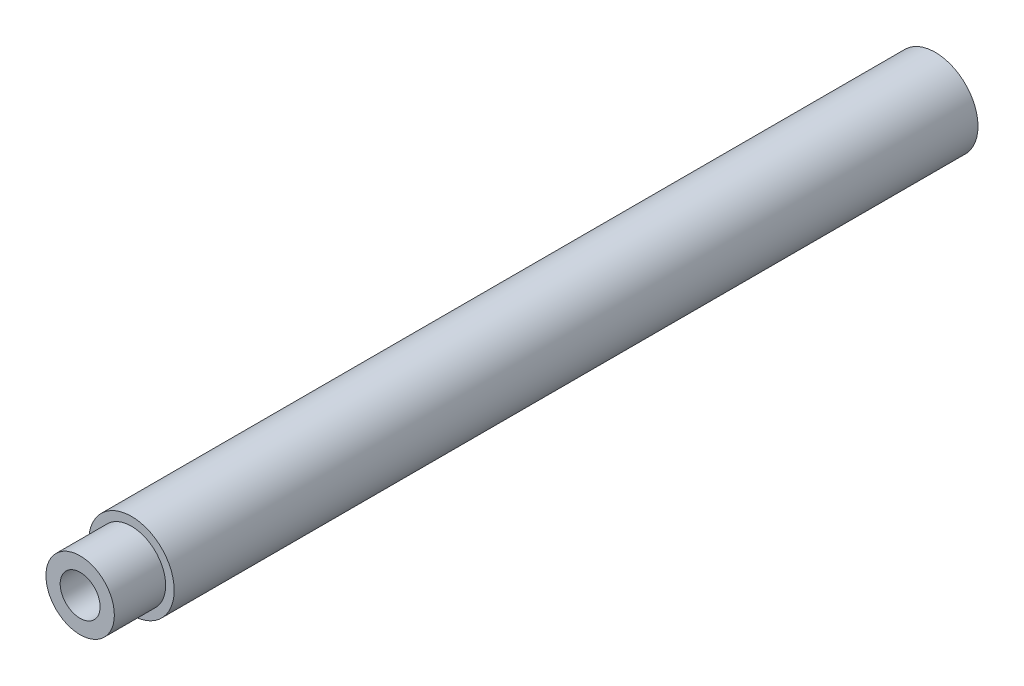
ISO-10303-21;
HEADER;
FILE_DESCRIPTION(('STEP AP214'),'2;1');
FILE_NAME('part.step','',(''),(''),'','','');
FILE_SCHEMA(('AUTOMOTIVE_DESIGN { 1 0 10303 214 1 1 1 1 }'));
ENDSEC;
DATA;
#1=APPLICATION_CONTEXT('core data for automotive mechanical design processes');
#2=APPLICATION_PROTOCOL_DEFINITION('international standard','automotive_design',2000,#1);
#3=PRODUCT_CONTEXT('',#1,'mechanical');
#4=PRODUCT('Part','Part','',(#3));
#5=PRODUCT_RELATED_PRODUCT_CATEGORY('part','',(#4));
#6=PRODUCT_DEFINITION_FORMATION('','',#4);
#7=PRODUCT_DEFINITION_CONTEXT('part definition',#1,'design');
#8=PRODUCT_DEFINITION('design','',#6,#7);
#9=PRODUCT_DEFINITION_SHAPE('','',#8);
#10=(LENGTH_UNIT() NAMED_UNIT(*) SI_UNIT(.MILLI.,.METRE.));
#11=(NAMED_UNIT(*) PLANE_ANGLE_UNIT() SI_UNIT($,.RADIAN.));
#12=(NAMED_UNIT(*) SI_UNIT($,.STERADIAN.) SOLID_ANGLE_UNIT());
#13=UNCERTAINTY_MEASURE_WITH_UNIT(LENGTH_MEASURE(1.E-05),#10,'distance_accuracy_value','');
#14=(GEOMETRIC_REPRESENTATION_CONTEXT(3) GLOBAL_UNCERTAINTY_ASSIGNED_CONTEXT((#13)) GLOBAL_UNIT_ASSIGNED_CONTEXT((#10,
#11,#12)) REPRESENTATION_CONTEXT('',''));
#15=CARTESIAN_POINT('',(0.,0.,0.));
#16=DIRECTION('',(0.,0.,1.));
#17=DIRECTION('',(1.,0.,0.));
#18=AXIS2_PLACEMENT_3D('',#15,#16,#17);
#19=CARTESIAN_POINT('',(0.,0.,150.));
#20=DIRECTION('',(0.,0.,-1.));
#21=DIRECTION('',(-1.,0.,0.));
#22=AXIS2_PLACEMENT_3D('',#19,#20,#21);
#23=CYLINDRICAL_SURFACE('',#22,7.5);
#24=CARTESIAN_POINT('',(0.,0.,0.));
#25=DIRECTION('',(0.,0.,1.));
#26=DIRECTION('',(1.,0.,0.));
#27=AXIS2_PLACEMENT_3D('',#24,#25,#26);
#28=CIRCLE('',#27,7.5);
#29=CARTESIAN_POINT('',(7.5,0.,0.));
#30=VERTEX_POINT('',#29);
#31=EDGE_CURVE('E10',#30,#30,#28,.T.);
#32=ORIENTED_EDGE('',*,*,#31,.T.);
#33=EDGE_LOOP('',(#32));
#34=FACE_BOUND('',#33,.T.);
#35=CARTESIAN_POINT('',(0.,0.,141.));
#36=DIRECTION('',(0.,0.,1.));
#37=DIRECTION('',(1.,0.,0.));
#38=AXIS2_PLACEMENT_3D('',#35,#36,#37);
#39=CIRCLE('',#38,7.5);
#40=CARTESIAN_POINT('',(7.5,0.,141.));
#41=VERTEX_POINT('',#40);
#42=EDGE_CURVE('E38',#41,#41,#39,.T.);
#43=ORIENTED_EDGE('',*,*,#42,.F.);
#44=EDGE_LOOP('',(#43));
#45=FACE_BOUND('',#44,.T.);
#46=ADVANCED_FACE('F32',(#34,#45),#23,.T.);
#47=CARTESIAN_POINT('',(0.,0.,0.));
#48=DIRECTION('',(0.,0.,1.));
#49=DIRECTION('',(1.,0.,0.));
#50=AXIS2_PLACEMENT_3D('',#47,#48,#49);
#51=PLANE('',#50);
#52=ORIENTED_EDGE('',*,*,#31,.F.);
#53=EDGE_LOOP('',(#52));
#54=FACE_BOUND('',#53,.T.);
#55=ADVANCED_FACE('F80',(#54),#51,.F.);
#56=CARTESIAN_POINT('',(0.,0.,141.));
#57=DIRECTION('',(0.,0.,1.));
#58=DIRECTION('',(1.,0.,0.));
#59=AXIS2_PLACEMENT_3D('',#56,#57,#58);
#60=PLANE('',#59);
#61=CARTESIAN_POINT('',(0.,0.,141.));
#62=DIRECTION('',(0.,0.,1.));
#63=DIRECTION('',(1.,0.,0.));
#64=AXIS2_PLACEMENT_3D('',#61,#62,#63);
#65=CIRCLE('',#64,6.);
#66=CARTESIAN_POINT('',(6.,0.,141.));
#67=VERTEX_POINT('',#66);
#68=EDGE_CURVE('E42',#67,#67,#65,.T.);
#69=ORIENTED_EDGE('',*,*,#68,.F.);
#70=EDGE_LOOP('',(#69));
#71=FACE_BOUND('',#70,.T.);
#72=ORIENTED_EDGE('',*,*,#42,.T.);
#73=EDGE_LOOP('',(#72));
#74=FACE_BOUND('',#73,.T.);
#75=ADVANCED_FACE('F74',(#71,#74),#60,.T.);
#76=CARTESIAN_POINT('',(0.,0.,141.));
#77=DIRECTION('',(0.,0.,1.));
#78=DIRECTION('',(1.,0.,0.));
#79=AXIS2_PLACEMENT_3D('',#76,#77,#78);
#80=CYLINDRICAL_SURFACE('',#79,6.);
#81=ORIENTED_EDGE('',*,*,#68,.T.);
#82=EDGE_LOOP('',(#81));
#83=FACE_BOUND('',#82,.T.);
#84=CARTESIAN_POINT('',(0.,0.,150.));
#85=DIRECTION('',(0.,0.,1.));
#86=DIRECTION('',(1.,0.,0.));
#87=AXIS2_PLACEMENT_3D('',#84,#85,#86);
#88=CIRCLE('',#87,6.);
#89=CARTESIAN_POINT('',(6.,0.,150.));
#90=VERTEX_POINT('',#89);
#91=EDGE_CURVE('E46',#90,#90,#88,.T.);
#92=ORIENTED_EDGE('',*,*,#91,.F.);
#93=EDGE_LOOP('',(#92));
#94=FACE_BOUND('',#93,.T.);
#95=ADVANCED_FACE('F69',(#83,#94),#80,.T.);
#96=CARTESIAN_POINT('',(0.,0.,150.));
#97=DIRECTION('',(0.,0.,1.));
#98=DIRECTION('',(1.,0.,0.));
#99=AXIS2_PLACEMENT_3D('',#96,#97,#98);
#100=PLANE('',#99);
#101=CARTESIAN_POINT('',(0.,0.,150.));
#102=DIRECTION('',(0.,0.,1.));
#103=DIRECTION('',(1.,0.,0.));
#104=AXIS2_PLACEMENT_3D('',#101,#102,#103);
#105=CIRCLE('',#104,3.5);
#106=CARTESIAN_POINT('',(3.5,0.,150.));
#107=VERTEX_POINT('',#106);
#108=EDGE_CURVE('E52',#107,#107,#105,.T.);
#109=ORIENTED_EDGE('',*,*,#108,.F.);
#110=EDGE_LOOP('',(#109));
#111=FACE_BOUND('',#110,.T.);
#112=ORIENTED_EDGE('',*,*,#91,.T.);
#113=EDGE_LOOP('',(#112));
#114=FACE_BOUND('',#113,.T.);
#115=ADVANCED_FACE('F63',(#111,#114),#100,.T.);
#116=CARTESIAN_POINT('',(0.,0.,130.));
#117=DIRECTION('',(0.,0.,1.));
#118=DIRECTION('',(1.,0.,0.));
#119=AXIS2_PLACEMENT_3D('',#116,#117,#118);
#120=CYLINDRICAL_SURFACE('',#119,3.5);
#121=CARTESIAN_POINT('',(0.,0.,130.));
#122=DIRECTION('',(0.,0.,1.));
#123=DIRECTION('',(1.,0.,0.));
#124=AXIS2_PLACEMENT_3D('',#121,#122,#123);
#125=CIRCLE('',#124,3.5);
#126=CARTESIAN_POINT('',(3.5,0.,130.));
#127=VERTEX_POINT('',#126);
#128=EDGE_CURVE('E50',#127,#127,#125,.T.);
#129=ORIENTED_EDGE('',*,*,#128,.F.);
#130=EDGE_LOOP('',(#129));
#131=FACE_BOUND('',#130,.T.);
#132=ORIENTED_EDGE('',*,*,#108,.T.);
#133=EDGE_LOOP('',(#132));
#134=FACE_BOUND('',#133,.T.);
#135=ADVANCED_FACE('F60',(#131,#134),#120,.F.);
#136=CARTESIAN_POINT('',(0.,0.,130.));
#137=DIRECTION('',(0.,0.,1.));
#138=DIRECTION('',(1.,0.,0.));
#139=AXIS2_PLACEMENT_3D('',#136,#137,#138);
#140=PLANE('',#139);
#141=ORIENTED_EDGE('',*,*,#128,.T.);
#142=EDGE_LOOP('',(#141));
#143=FACE_BOUND('',#142,.T.);
#144=ADVANCED_FACE('F58',(#143),#140,.T.);
#145=CLOSED_SHELL('',(#46,#55,#75,#95,#115,#135,#144));
#146=MANIFOLD_SOLID_BREP('B2',#145);
#147=ADVANCED_BREP_SHAPE_REPRESENTATION('',(#18,#146),#14);
#148=SHAPE_DEFINITION_REPRESENTATION(#9,#147);
ENDSEC;
END-ISO-10303-21;
